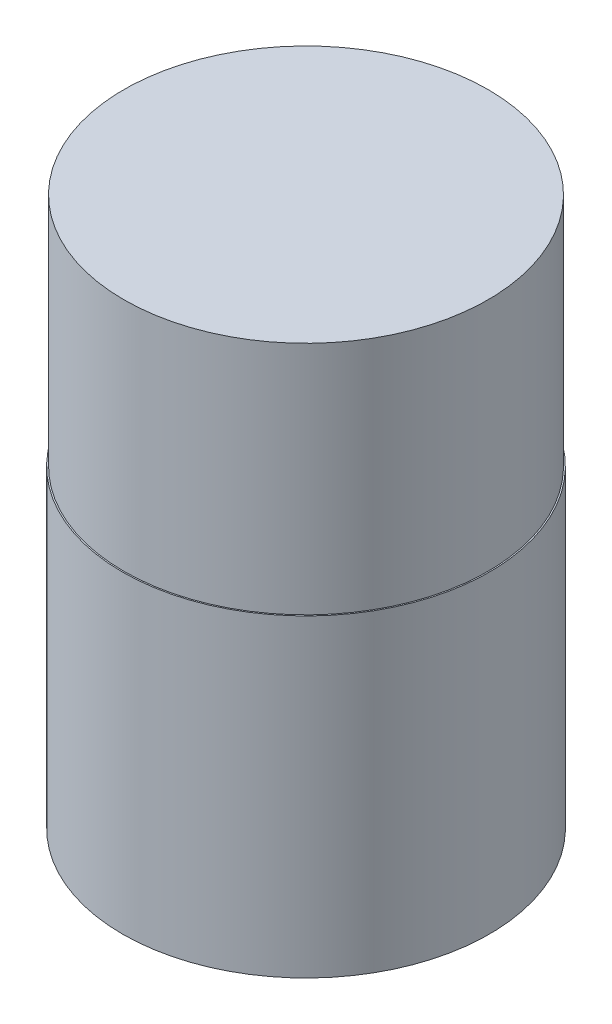
ISO-10303-21;
HEADER;
FILE_DESCRIPTION(('STEP AP214'),'2;1');
FILE_NAME('part.step','',(''),(''),'','','');
FILE_SCHEMA(('AUTOMOTIVE_DESIGN { 1 0 10303 214 1 1 1 1 }'));
ENDSEC;
DATA;
#1=APPLICATION_CONTEXT('core data for automotive mechanical design processes');
#2=APPLICATION_PROTOCOL_DEFINITION('international standard','automotive_design',2000,#1);
#3=PRODUCT_CONTEXT('',#1,'mechanical');
#4=PRODUCT('Part','Part','',(#3));
#5=PRODUCT_RELATED_PRODUCT_CATEGORY('part','',(#4));
#6=PRODUCT_DEFINITION_FORMATION('','',#4);
#7=PRODUCT_DEFINITION_CONTEXT('part definition',#1,'design');
#8=PRODUCT_DEFINITION('design','',#6,#7);
#9=PRODUCT_DEFINITION_SHAPE('','',#8);
#10=(LENGTH_UNIT() NAMED_UNIT(*) SI_UNIT(.MILLI.,.METRE.));
#11=(NAMED_UNIT(*) PLANE_ANGLE_UNIT() SI_UNIT($,.RADIAN.));
#12=(NAMED_UNIT(*) SI_UNIT($,.STERADIAN.) SOLID_ANGLE_UNIT());
#13=UNCERTAINTY_MEASURE_WITH_UNIT(LENGTH_MEASURE(1.E-05),#10,'distance_accuracy_value','');
#14=(GEOMETRIC_REPRESENTATION_CONTEXT(3) GLOBAL_UNCERTAINTY_ASSIGNED_CONTEXT((#13)) GLOBAL_UNIT_ASSIGNED_CONTEXT((#10,
#11,#12)) REPRESENTATION_CONTEXT('',''));
#15=CARTESIAN_POINT('',(0.,0.,0.));
#16=DIRECTION('',(0.,0.,1.));
#17=DIRECTION('',(1.,0.,0.));
#18=AXIS2_PLACEMENT_3D('',#15,#16,#17);
#19=CARTESIAN_POINT('',(0.,10.16,0.));
#20=DIRECTION('',(0.,1.,0.));
#21=DIRECTION('',(0.,0.,1.));
#22=AXIS2_PLACEMENT_3D('',#19,#20,#21);
#23=PLANE('',#22);
#24=CARTESIAN_POINT('',(0.,10.16,0.));
#25=DIRECTION('',(0.,1.,0.));
#26=DIRECTION('',(0.,0.,1.));
#27=AXIS2_PLACEMENT_3D('',#24,#25,#26);
#28=CIRCLE('',#27,5.9436);
#29=CARTESIAN_POINT('',(0.,10.16,5.9436));
#30=VERTEX_POINT('',#29);
#31=EDGE_CURVE('E10',#30,#30,#28,.T.);
#32=ORIENTED_EDGE('',*,*,#31,.T.);
#33=EDGE_LOOP('',(#32));
#34=FACE_BOUND('',#33,.T.);
#35=CARTESIAN_POINT('',(0.,10.16,0.));
#36=DIRECTION('',(0.,1.,0.));
#37=DIRECTION('',(0.,0.,1.));
#38=AXIS2_PLACEMENT_3D('',#35,#36,#37);
#39=CIRCLE('',#38,5.9);
#40=CARTESIAN_POINT('',(0.,10.16,-5.9));
#41=VERTEX_POINT('',#40);
#42=EDGE_CURVE('E44',#41,#41,#39,.T.);
#43=ORIENTED_EDGE('',*,*,#42,.F.);
#44=EDGE_LOOP('',(#43));
#45=FACE_BOUND('',#44,.T.);
#46=ADVANCED_FACE('F31',(#34,#45),#23,.T.);
#47=CARTESIAN_POINT('',(0.,10.16,0.));
#48=DIRECTION('',(0.,-1.,0.));
#49=DIRECTION('',(0.,0.,-1.));
#50=AXIS2_PLACEMENT_3D('',#47,#48,#49);
#51=CYLINDRICAL_SURFACE('',#50,5.9436);
#52=ORIENTED_EDGE('',*,*,#31,.F.);
#53=EDGE_LOOP('',(#52));
#54=FACE_BOUND('',#53,.T.);
#55=CARTESIAN_POINT('',(0.,0.,0.));
#56=DIRECTION('',(0.,1.,0.));
#57=DIRECTION('',(0.,0.,1.));
#58=AXIS2_PLACEMENT_3D('',#55,#56,#57);
#59=CIRCLE('',#58,5.9436);
#60=CARTESIAN_POINT('',(0.,0.,5.9436));
#61=VERTEX_POINT('',#60);
#62=EDGE_CURVE('E35',#61,#61,#59,.T.);
#63=ORIENTED_EDGE('',*,*,#62,.T.);
#64=EDGE_LOOP('',(#63));
#65=FACE_BOUND('',#64,.T.);
#66=ADVANCED_FACE('F33',(#54,#65),#51,.T.);
#67=CARTESIAN_POINT('',(0.,0.,0.));
#68=DIRECTION('',(0.,1.,0.));
#69=DIRECTION('',(0.,0.,1.));
#70=AXIS2_PLACEMENT_3D('',#67,#68,#69);
#71=PLANE('',#70);
#72=ORIENTED_EDGE('',*,*,#62,.F.);
#73=EDGE_LOOP('',(#72));
#74=FACE_BOUND('',#73,.T.);
#75=ADVANCED_FACE('F55',(#74),#71,.F.);
#76=CARTESIAN_POINT('',(0.,17.78,0.));
#77=DIRECTION('',(0.,-1.,0.));
#78=DIRECTION('',(0.,0.,-1.));
#79=AXIS2_PLACEMENT_3D('',#76,#77,#78);
#80=CYLINDRICAL_SURFACE('',#79,5.9);
#81=CARTESIAN_POINT('',(0.,17.78,0.));
#82=DIRECTION('',(0.,1.,0.));
#83=DIRECTION('',(0.,0.,1.));
#84=AXIS2_PLACEMENT_3D('',#81,#82,#83);
#85=CIRCLE('',#84,5.9);
#86=CARTESIAN_POINT('',(0.,17.78,-5.9));
#87=VERTEX_POINT('',#86);
#88=EDGE_CURVE('E42',#87,#87,#85,.T.);
#89=CARTESIAN_POINT('',(0.,17.78,-5.9));
#90=CARTESIAN_POINT('',(0.,17.700625,-5.9));
#91=CARTESIAN_POINT('',(0.,17.62125,-5.9));
#92=CARTESIAN_POINT('',(0.,17.4625,-5.9));
#93=CARTESIAN_POINT('',(0.,17.383125,-5.9));
#94=CARTESIAN_POINT('',(0.,17.224375,-5.9));
#95=CARTESIAN_POINT('',(0.,17.145,-5.9));
#96=CARTESIAN_POINT('',(0.,16.98625,-5.9));
#97=CARTESIAN_POINT('',(0.,16.906875,-5.9));
#98=CARTESIAN_POINT('',(0.,16.748125,-5.9));
#99=CARTESIAN_POINT('',(0.,16.66875,-5.9));
#100=CARTESIAN_POINT('',(0.,16.51,-5.9));
#101=CARTESIAN_POINT('',(0.,16.430625,-5.9));
#102=CARTESIAN_POINT('',(0.,16.271875,-5.9));
#103=CARTESIAN_POINT('',(0.,16.1925,-5.9));
#104=CARTESIAN_POINT('',(0.,16.03375,-5.9));
#105=CARTESIAN_POINT('',(0.,15.954375,-5.9));
#106=CARTESIAN_POINT('',(0.,15.795625,-5.9));
#107=CARTESIAN_POINT('',(0.,15.71625,-5.9));
#108=CARTESIAN_POINT('',(0.,15.5575,-5.9));
#109=CARTESIAN_POINT('',(0.,15.478125,-5.9));
#110=CARTESIAN_POINT('',(0.,15.319375,-5.9));
#111=CARTESIAN_POINT('',(0.,15.24,-5.9));
#112=CARTESIAN_POINT('',(0.,15.08125,-5.9));
#113=CARTESIAN_POINT('',(0.,15.001875,-5.9));
#114=CARTESIAN_POINT('',(0.,14.843125,-5.9));
#115=CARTESIAN_POINT('',(0.,14.76375,-5.9));
#116=CARTESIAN_POINT('',(0.,14.605,-5.9));
#117=CARTESIAN_POINT('',(0.,14.525625,-5.9));
#118=CARTESIAN_POINT('',(0.,14.366875,-5.9));
#119=CARTESIAN_POINT('',(0.,14.2875,-5.9));
#120=CARTESIAN_POINT('',(0.,14.12875,-5.9));
#121=CARTESIAN_POINT('',(0.,14.049375,-5.9));
#122=CARTESIAN_POINT('',(0.,13.890625,-5.9));
#123=CARTESIAN_POINT('',(0.,13.81125,-5.9));
#124=CARTESIAN_POINT('',(0.,13.6525,-5.9));
#125=CARTESIAN_POINT('',(0.,13.573125,-5.9));
#126=CARTESIAN_POINT('',(0.,13.414375,-5.9));
#127=CARTESIAN_POINT('',(0.,13.335,-5.9));
#128=CARTESIAN_POINT('',(0.,13.17625,-5.9));
#129=CARTESIAN_POINT('',(0.,13.096875,-5.9));
#130=CARTESIAN_POINT('',(0.,12.938125,-5.9));
#131=CARTESIAN_POINT('',(0.,12.85875,-5.9));
#132=CARTESIAN_POINT('',(0.,12.7,-5.9));
#133=CARTESIAN_POINT('',(0.,12.620625,-5.9));
#134=CARTESIAN_POINT('',(0.,12.461875,-5.9));
#135=CARTESIAN_POINT('',(0.,12.3825,-5.9));
#136=CARTESIAN_POINT('',(0.,12.22375,-5.9));
#137=CARTESIAN_POINT('',(0.,12.144375,-5.9));
#138=CARTESIAN_POINT('',(0.,11.985625,-5.9));
#139=CARTESIAN_POINT('',(0.,11.90625,-5.9));
#140=CARTESIAN_POINT('',(0.,11.7475,-5.9));
#141=CARTESIAN_POINT('',(0.,11.668125,-5.9));
#142=CARTESIAN_POINT('',(0.,11.509375,-5.9));
#143=CARTESIAN_POINT('',(0.,11.43,-5.9));
#144=CARTESIAN_POINT('',(0.,11.27125,-5.9));
#145=CARTESIAN_POINT('',(0.,11.191875,-5.9));
#146=CARTESIAN_POINT('',(0.,11.033125,-5.9));
#147=CARTESIAN_POINT('',(0.,10.95375,-5.9));
#148=CARTESIAN_POINT('',(0.,10.795,-5.9));
#149=CARTESIAN_POINT('',(0.,10.715625,-5.9));
#150=CARTESIAN_POINT('',(0.,10.556875,-5.9));
#151=CARTESIAN_POINT('',(0.,10.4775,-5.9));
#152=CARTESIAN_POINT('',(0.,10.31875,-5.9));
#153=CARTESIAN_POINT('',(0.,10.239375,-5.9));
#154=CARTESIAN_POINT('',(0.,10.16,-5.9));
#155=B_SPLINE_CURVE_WITH_KNOTS('',3,(#89,#90,#91,#92,#93,#94,#95,#96,#97,#98,#99,#100,#101,#102,
#103,#104,#105,#106,#107,#108,#109,#110,#111,#112,#113,#114,#115,#116,#117,#118,#119,#120,#121,
#122,#123,#124,#125,#126,#127,#128,#129,#130,#131,#132,#133,#134,#135,#136,#137,#138,#139,#140,
#141,#142,#143,#144,#145,#146,#147,#148,#149,#150,#151,#152,#153,#154),.UNSPECIFIED.,.F.,.F.,(4,
2,2,2,2,2,2,2,2,2,2,2,2,2,2,2,2,2,2,2,2,2,2,2,2,2,2,2,2,2,2,2,4),(0.,0.238125000000002,
0.476250000000001,0.714375000000003,0.952500000000002,1.190625,1.42875,1.666875,1.905,2.143125,
2.38125,2.619375,2.8575,3.095625,3.33375,3.571875,3.81,4.048125,4.28625,4.524375,4.7625,
5.000625,5.23875,5.476875,5.715,5.953125,6.19125,6.429375,6.6675,6.905625,7.14375,7.381875,
7.62),.UNSPECIFIED.);
#156=EDGE_CURVE('BSEAM52',#87,#41,#155,.T.);
#157=ORIENTED_EDGE('',*,*,#88,.F.);
#158=ORIENTED_EDGE('',*,*,#42,.T.);
#159=ORIENTED_EDGE('',*,*,#156,.T.);
#160=ORIENTED_EDGE('',*,*,#156,.F.);
#161=EDGE_LOOP('',(#157,#159,#158,#160));
#162=FACE_BOUND('',#161,.T.);
#163=ADVANCED_FACE('F52',(#162),#80,.T.);
#164=CARTESIAN_POINT('',(0.,17.78,0.));
#165=DIRECTION('',(0.,1.,0.));
#166=DIRECTION('',(0.,0.,1.));
#167=AXIS2_PLACEMENT_3D('',#164,#165,#166);
#168=PLANE('',#167);
#169=ORIENTED_EDGE('',*,*,#88,.T.);
#170=EDGE_LOOP('',(#169));
#171=FACE_BOUND('',#170,.T.);
#172=ADVANCED_FACE('F50',(#171),#168,.T.);
#173=CLOSED_SHELL('',(#46,#66,#75,#163,#172));
#174=MANIFOLD_SOLID_BREP('B2',#173);
#175=ADVANCED_BREP_SHAPE_REPRESENTATION('',(#18,#174),#14);
#176=SHAPE_DEFINITION_REPRESENTATION(#9,#175);
ENDSEC;
END-ISO-10303-21;
